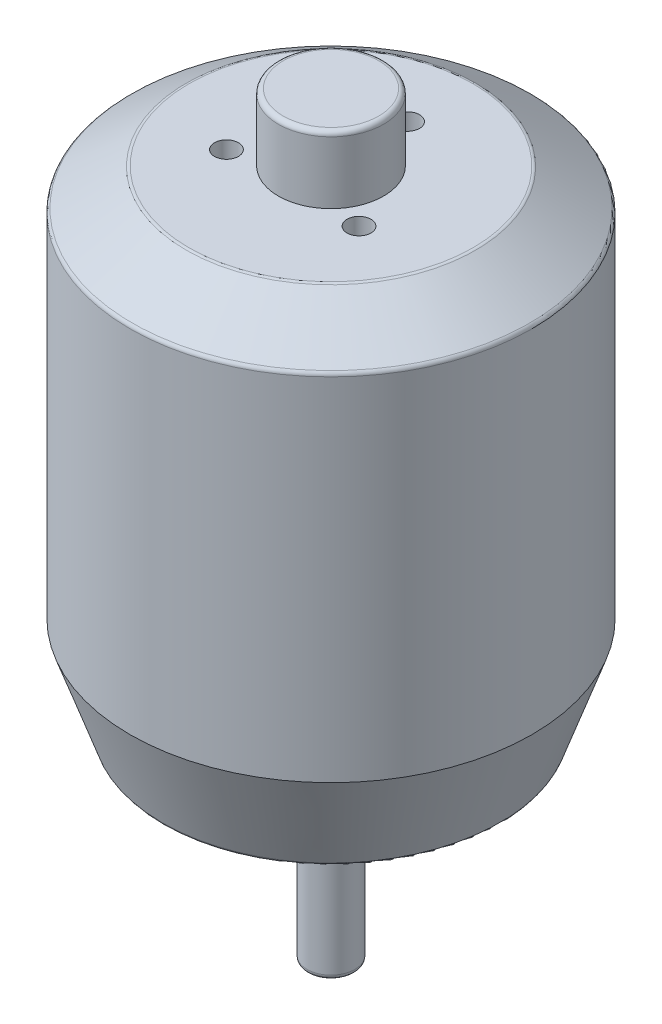
ISO-10303-21;
HEADER;
FILE_DESCRIPTION(('STEP AP214'),'2;1');
FILE_NAME('part.step','',(''),(''),'','','');
FILE_SCHEMA(('AUTOMOTIVE_DESIGN { 1 0 10303 214 1 1 1 1 }'));
ENDSEC;
DATA;
#1=APPLICATION_CONTEXT('core data for automotive mechanical design processes');
#2=APPLICATION_PROTOCOL_DEFINITION('international standard','automotive_design',2000,#1);
#3=PRODUCT_CONTEXT('',#1,'mechanical');
#4=PRODUCT('Part','Part','',(#3));
#5=PRODUCT_RELATED_PRODUCT_CATEGORY('part','',(#4));
#6=PRODUCT_DEFINITION_FORMATION('','',#4);
#7=PRODUCT_DEFINITION_CONTEXT('part definition',#1,'design');
#8=PRODUCT_DEFINITION('design','',#6,#7);
#9=PRODUCT_DEFINITION_SHAPE('','',#8);
#10=(LENGTH_UNIT() NAMED_UNIT(*) SI_UNIT(.MILLI.,.METRE.));
#11=(NAMED_UNIT(*) PLANE_ANGLE_UNIT() SI_UNIT($,.RADIAN.));
#12=(NAMED_UNIT(*) SI_UNIT($,.STERADIAN.) SOLID_ANGLE_UNIT());
#13=UNCERTAINTY_MEASURE_WITH_UNIT(LENGTH_MEASURE(1.E-05),#10,'distance_accuracy_value','');
#14=(GEOMETRIC_REPRESENTATION_CONTEXT(3) GLOBAL_UNCERTAINTY_ASSIGNED_CONTEXT((#13)) GLOBAL_UNIT_ASSIGNED_CONTEXT((#10,
#11,#12)) REPRESENTATION_CONTEXT('',''));
#15=CARTESIAN_POINT('',(0.,0.,0.));
#16=DIRECTION('',(0.,0.,1.));
#17=DIRECTION('',(1.,0.,0.));
#18=AXIS2_PLACEMENT_3D('',#15,#16,#17);
#19=CARTESIAN_POINT('',(0.,47.,0.));
#20=DIRECTION('',(0.,-1.,0.));
#21=DIRECTION('',(0.,0.,-1.));
#22=AXIS2_PLACEMENT_3D('',#19,#20,#21);
#23=CYLINDRICAL_SURFACE('',#22,21.);
#24=CARTESIAN_POINT('',(0.,46.732408120756,0.));
#25=DIRECTION('',(0.,-1.,0.));
#26=DIRECTION('',(0.,0.,-1.));
#27=AXIS2_PLACEMENT_3D('',#24,#25,#26);
#28=CIRCLE('',#27,21.);
#29=CARTESIAN_POINT('',(0.,46.732408120756,-21.));
#30=VERTEX_POINT('',#29);
#31=EDGE_CURVE('E52',#30,#30,#28,.T.);
#32=ORIENTED_EDGE('',*,*,#31,.T.);
#33=EDGE_LOOP('',(#32));
#34=FACE_BOUND('',#33,.T.);
#35=CARTESIAN_POINT('',(0.,10.,0.));
#36=DIRECTION('',(0.,1.,0.));
#37=DIRECTION('',(0.,0.,1.));
#38=AXIS2_PLACEMENT_3D('',#35,#36,#37);
#39=CIRCLE('',#38,21.);
#40=CARTESIAN_POINT('',(0.,10.,21.));
#41=VERTEX_POINT('',#40);
#42=EDGE_CURVE('E86',#41,#41,#39,.T.);
#43=ORIENTED_EDGE('',*,*,#42,.T.);
#44=EDGE_LOOP('',(#43));
#45=FACE_BOUND('',#44,.T.);
#46=ADVANCED_FACE('F37',(#34,#45),#23,.T.);
#47=CARTESIAN_POINT('',(0.,0.,0.));
#48=DIRECTION('',(0.,1.,0.));
#49=DIRECTION('',(0.,0.,1.));
#50=AXIS2_PLACEMENT_3D('',#47,#48,#49);
#51=CONICAL_SURFACE('',#50,17.5,0.336674819386727);
#52=CARTESIAN_POINT('',(0.,0.334824787635947,0.));
#53=DIRECTION('',(0.,1.,0.));
#54=DIRECTION('',(0.,0.,1.));
#55=AXIS2_PLACEMENT_3D('',#52,#53,#54);
#56=CIRCLE('',#55,17.6171886756726);
#57=CARTESIAN_POINT('',(0.,0.334824787635947,17.6171886756726));
#58=VERTEX_POINT('',#57);
#59=EDGE_CURVE('E66',#58,#58,#56,.T.);
#60=ORIENTED_EDGE('',*,*,#59,.T.);
#61=EDGE_LOOP('',(#60));
#62=FACE_BOUND('',#61,.T.);
#63=ORIENTED_EDGE('',*,*,#42,.F.);
#64=EDGE_LOOP('',(#63));
#65=FACE_BOUND('',#64,.T.);
#66=ADVANCED_FACE('F188',(#62,#65),#51,.T.);
#67=CARTESIAN_POINT('',(0.,0.,0.));
#68=DIRECTION('',(0.,1.,0.));
#69=DIRECTION('',(0.,0.,1.));
#70=AXIS2_PLACEMENT_3D('',#67,#68,#69);
#71=PLANE('',#70);
#72=CARTESIAN_POINT('',(0.,0.,0.));
#73=DIRECTION('',(0.,1.,0.));
#74=DIRECTION('',(0.,0.,1.));
#75=AXIS2_PLACEMENT_3D('',#72,#73,#74);
#76=CIRCLE('',#75,17.1452594974896);
#77=CARTESIAN_POINT('',(0.,0.,17.1452594974896));
#78=VERTEX_POINT('',#77);
#79=EDGE_CURVE('E63',#78,#78,#76,.F.);
#80=ORIENTED_EDGE('',*,*,#79,.T.);
#81=EDGE_LOOP('',(#80));
#82=FACE_BOUND('',#81,.T.);
#83=CARTESIAN_POINT('',(0.,0.,0.));
#84=DIRECTION('',(0.,1.,0.));
#85=DIRECTION('',(0.,0.,1.));
#86=AXIS2_PLACEMENT_3D('',#83,#84,#85);
#87=CIRCLE('',#86,5.5);
#88=CARTESIAN_POINT('',(0.,0.,5.5));
#89=VERTEX_POINT('',#88);
#90=EDGE_CURVE('E75',#89,#89,#87,.F.);
#91=ORIENTED_EDGE('',*,*,#90,.F.);
#92=EDGE_LOOP('',(#91));
#93=FACE_BOUND('',#92,.T.);
#94=CARTESIAN_POINT('',(-8.83883476483135,0.,-8.83883476483185));
#95=DIRECTION('',(0.,-1.,0.));
#96=DIRECTION('',(0.,0.,-1.));
#97=AXIS2_PLACEMENT_3D('',#94,#95,#96);
#98=CIRCLE('',#97,4.00000000000026);
#99=CARTESIAN_POINT('',(-8.83883476483135,0.,-12.8388347648321));
#100=VERTEX_POINT('',#99);
#101=EDGE_CURVE('E79',#100,#100,#98,.T.);
#102=ORIENTED_EDGE('',*,*,#101,.F.);
#103=EDGE_LOOP('',(#102));
#104=FACE_BOUND('',#103,.T.);
#105=CARTESIAN_POINT('',(8.83883476483235,0.,-8.83883476483135));
#106=DIRECTION('',(0.,-1.,0.));
#107=DIRECTION('',(0.,0.,-1.));
#108=AXIS2_PLACEMENT_3D('',#105,#106,#107);
#109=CIRCLE('',#108,4.0000000000007);
#110=CARTESIAN_POINT('',(8.83883476483235,0.,-12.838834764832));
#111=VERTEX_POINT('',#110);
#112=EDGE_CURVE('E119',#111,#111,#109,.T.);
#113=ORIENTED_EDGE('',*,*,#112,.F.);
#114=EDGE_LOOP('',(#113));
#115=FACE_BOUND('',#114,.T.);
#116=CARTESIAN_POINT('',(8.83883476483185,0.,8.83883476483234));
#117=DIRECTION('',(0.,-1.,0.));
#118=DIRECTION('',(0.,0.,-1.));
#119=AXIS2_PLACEMENT_3D('',#116,#117,#118);
#120=CIRCLE('',#119,4.00000000000051);
#121=CARTESIAN_POINT('',(8.83883476483185,0.,4.83883476483183));
#122=VERTEX_POINT('',#121);
#123=EDGE_CURVE('E125',#122,#122,#120,.T.);
#124=ORIENTED_EDGE('',*,*,#123,.F.);
#125=EDGE_LOOP('',(#124));
#126=FACE_BOUND('',#125,.T.);
#127=CARTESIAN_POINT('',(-8.83883476483184,0.,8.83883476483184));
#128=DIRECTION('',(0.,-1.,0.));
#129=DIRECTION('',(0.,0.,-1.));
#130=AXIS2_PLACEMENT_3D('',#127,#128,#129);
#131=CIRCLE('',#130,4.);
#132=CARTESIAN_POINT('',(-8.83883476483184,0.,4.83883476483184));
#133=VERTEX_POINT('',#132);
#134=EDGE_CURVE('E131',#133,#133,#131,.T.);
#135=ORIENTED_EDGE('',*,*,#134,.F.);
#136=EDGE_LOOP('',(#135));
#137=FACE_BOUND('',#136,.T.);
#138=CARTESIAN_POINT('',(-12.4999999999996,0.,-3.5527136788005E-13));
#139=DIRECTION('',(0.,-1.,0.));
#140=DIRECTION('',(0.,0.,-1.));
#141=AXIS2_PLACEMENT_3D('',#138,#139,#140);
#142=CIRCLE('',#141,1.50000000000057);
#143=CARTESIAN_POINT('',(-12.4999999999996,0.,-1.50000000000092));
#144=VERTEX_POINT('',#143);
#145=EDGE_CURVE('E96',#144,#144,#142,.T.);
#146=ORIENTED_EDGE('',*,*,#145,.F.);
#147=EDGE_LOOP('',(#146));
#148=FACE_BOUND('',#147,.T.);
#149=CARTESIAN_POINT('',(7.07481118762232E-13,0.,-12.5));
#150=DIRECTION('',(0.,-1.,0.));
#151=DIRECTION('',(0.,0.,-1.));
#152=AXIS2_PLACEMENT_3D('',#149,#150,#151);
#153=CIRCLE('',#152,1.50000000000076);
#154=CARTESIAN_POINT('',(7.07481118762232E-13,0.,-14.0000000000008));
#155=VERTEX_POINT('',#154);
#156=EDGE_CURVE('E103',#155,#155,#153,.T.);
#157=ORIENTED_EDGE('',*,*,#156,.F.);
#158=EDGE_LOOP('',(#157));
#159=FACE_BOUND('',#158,.T.);
#160=CARTESIAN_POINT('',(12.5000000000004,0.,3.53740559381116E-13));
#161=DIRECTION('',(0.,-1.,0.));
#162=DIRECTION('',(0.,0.,-1.));
#163=AXIS2_PLACEMENT_3D('',#160,#161,#162);
#164=CIRCLE('',#163,1.50000000000028);
#165=CARTESIAN_POINT('',(12.5000000000004,0.,-1.49999999999992));
#166=VERTEX_POINT('',#165);
#167=EDGE_CURVE('E109',#166,#166,#164,.T.);
#168=ORIENTED_EDGE('',*,*,#167,.F.);
#169=EDGE_LOOP('',(#168));
#170=FACE_BOUND('',#169,.T.);
#171=CARTESIAN_POINT('',(0.,0.,12.5));
#172=DIRECTION('',(0.,-1.,0.));
#173=DIRECTION('',(0.,0.,-1.));
#174=AXIS2_PLACEMENT_3D('',#171,#172,#173);
#175=CIRCLE('',#174,1.5);
#176=CARTESIAN_POINT('',(0.,0.,11.));
#177=VERTEX_POINT('',#176);
#178=EDGE_CURVE('E90',#177,#177,#175,.T.);
#179=ORIENTED_EDGE('',*,*,#178,.F.);
#180=EDGE_LOOP('',(#179));
#181=FACE_BOUND('',#180,.T.);
#182=ADVANCED_FACE('F194',(#82,#93,#104,#115,#126,#137,#148,#159,#170,#181),#71,.F.);
#183=CARTESIAN_POINT('',(0.,51.,0.));
#184=DIRECTION('',(0.,-1.,0.));
#185=DIRECTION('',(0.,0.,-1.));
#186=AXIS2_PLACEMENT_3D('',#183,#184,#185);
#187=CONICAL_SURFACE('',#186,15.,0.982793723247329);
#188=CARTESIAN_POINT('',(0.,47.1484332679249,0.));
#189=DIRECTION('',(0.,-1.,0.));
#190=DIRECTION('',(0.,0.,-1.));
#191=AXIS2_PLACEMENT_3D('',#188,#189,#190);
#192=CIRCLE('',#191,20.7773500981126);
#193=CARTESIAN_POINT('',(0.,47.1484332679249,-20.7773500981126));
#194=VERTEX_POINT('',#193);
#195=EDGE_CURVE('E57',#194,#194,#192,.F.);
#196=ORIENTED_EDGE('',*,*,#195,.T.);
#197=EDGE_LOOP('',(#196));
#198=FACE_BOUND('',#197,.T.);
#199=CARTESIAN_POINT('',(0.,50.9160251471689,0.));
#200=DIRECTION('',(0.,1.,0.));
#201=DIRECTION('',(0.,0.,1.));
#202=AXIS2_PLACEMENT_3D('',#199,#200,#201);
#203=CIRCLE('',#202,15.1259622792466);
#204=CARTESIAN_POINT('',(0.,50.9160251471689,15.1259622792466));
#205=VERTEX_POINT('',#204);
#206=EDGE_CURVE('E60',#205,#205,#203,.F.);
#207=ORIENTED_EDGE('',*,*,#206,.T.);
#208=EDGE_LOOP('',(#207));
#209=FACE_BOUND('',#208,.T.);
#210=ADVANCED_FACE('F185',(#198,#209),#187,.T.);
#211=CARTESIAN_POINT('',(0.,58.,0.));
#212=DIRECTION('',(0.,1.,0.));
#213=DIRECTION('',(0.,0.,1.));
#214=AXIS2_PLACEMENT_3D('',#211,#212,#213);
#215=PLANE('',#214);
#216=CARTESIAN_POINT('',(0.,58.,0.));
#217=DIRECTION('',(0.,1.,0.));
#218=DIRECTION('',(0.,0.,1.));
#219=AXIS2_PLACEMENT_3D('',#216,#217,#218);
#220=CIRCLE('',#219,5.);
#221=CARTESIAN_POINT('',(0.,58.,5.));
#222=VERTEX_POINT('',#221);
#223=EDGE_CURVE('E44',#222,#222,#220,.T.);
#224=ORIENTED_EDGE('',*,*,#223,.T.);
#225=EDGE_LOOP('',(#224));
#226=FACE_BOUND('',#225,.T.);
#227=ADVANCED_FACE('F180',(#226),#215,.T.);
#228=CARTESIAN_POINT('',(0.,58.,0.));
#229=DIRECTION('',(0.,-1.,0.));
#230=DIRECTION('',(0.,0.,-1.));
#231=AXIS2_PLACEMENT_3D('',#228,#229,#230);
#232=CYLINDRICAL_SURFACE('',#231,5.5);
#233=CARTESIAN_POINT('',(0.,57.5,0.));
#234=DIRECTION('',(0.,1.,0.));
#235=DIRECTION('',(0.,0.,1.));
#236=AXIS2_PLACEMENT_3D('',#233,#234,#235);
#237=CIRCLE('',#236,5.5);
#238=CARTESIAN_POINT('',(0.,57.5,5.5));
#239=VERTEX_POINT('',#238);
#240=EDGE_CURVE('E11',#239,#239,#237,.F.);
#241=ORIENTED_EDGE('',*,*,#240,.T.);
#242=EDGE_LOOP('',(#241));
#243=FACE_BOUND('',#242,.T.);
#244=CARTESIAN_POINT('',(0.,51.,0.));
#245=DIRECTION('',(0.,1.,0.));
#246=DIRECTION('',(0.,0.,1.));
#247=AXIS2_PLACEMENT_3D('',#244,#245,#246);
#248=CIRCLE('',#247,5.5);
#249=CARTESIAN_POINT('',(0.,51.,5.5));
#250=VERTEX_POINT('',#249);
#251=EDGE_CURVE('E83',#250,#250,#248,.T.);
#252=ORIENTED_EDGE('',*,*,#251,.T.);
#253=EDGE_LOOP('',(#252));
#254=FACE_BOUND('',#253,.T.);
#255=ADVANCED_FACE('F170',(#243,#254),#232,.T.);
#256=CARTESIAN_POINT('',(0.,51.,0.));
#257=DIRECTION('',(0.,1.,0.));
#258=DIRECTION('',(0.,0.,1.));
#259=AXIS2_PLACEMENT_3D('',#256,#257,#258);
#260=PLANE('',#259);
#261=CARTESIAN_POINT('',(0.,51.,0.));
#262=DIRECTION('',(0.,1.,0.));
#263=DIRECTION('',(0.,0.,1.));
#264=AXIS2_PLACEMENT_3D('',#261,#262,#263);
#265=CIRCLE('',#264,14.848612181134);
#266=CARTESIAN_POINT('',(0.,51.,14.848612181134));
#267=VERTEX_POINT('',#266);
#268=EDGE_CURVE('E48',#267,#267,#265,.T.);
#269=ORIENTED_EDGE('',*,*,#268,.T.);
#270=EDGE_LOOP('',(#269));
#271=FACE_BOUND('',#270,.T.);
#272=CARTESIAN_POINT('',(6.92820323027602,51.,3.9999999999997));
#273=DIRECTION('',(0.,1.,0.));
#274=DIRECTION('',(0.,0.,1.));
#275=AXIS2_PLACEMENT_3D('',#272,#273,#274);
#276=CIRCLE('',#275,1.25000000000044);
#277=CARTESIAN_POINT('',(6.92820323027602,51.,5.25000000000014));
#278=VERTEX_POINT('',#277);
#279=EDGE_CURVE('E151',#278,#278,#276,.T.);
#280=ORIENTED_EDGE('',*,*,#279,.F.);
#281=EDGE_LOOP('',(#280));
#282=FACE_BOUND('',#281,.T.);
#283=CARTESIAN_POINT('',(-6.928203230275,51.,4.0000000000003));
#284=DIRECTION('',(0.,1.,0.));
#285=DIRECTION('',(0.,0.,1.));
#286=AXIS2_PLACEMENT_3D('',#283,#284,#285);
#287=CIRCLE('',#286,1.25000000000065);
#288=CARTESIAN_POINT('',(-6.928203230275,51.,5.25000000000095));
#289=VERTEX_POINT('',#288);
#290=EDGE_CURVE('E145',#289,#289,#287,.T.);
#291=ORIENTED_EDGE('',*,*,#290,.F.);
#292=EDGE_LOOP('',(#291));
#293=FACE_BOUND('',#292,.T.);
#294=CARTESIAN_POINT('',(0.,51.,-8.));
#295=DIRECTION('',(0.,1.,0.));
#296=DIRECTION('',(0.,0.,1.));
#297=AXIS2_PLACEMENT_3D('',#294,#295,#296);
#298=CIRCLE('',#297,1.25);
#299=CARTESIAN_POINT('',(0.,51.,-6.75));
#300=VERTEX_POINT('',#299);
#301=EDGE_CURVE('E139',#300,#300,#298,.T.);
#302=ORIENTED_EDGE('',*,*,#301,.F.);
#303=EDGE_LOOP('',(#302));
#304=FACE_BOUND('',#303,.T.);
#305=ORIENTED_EDGE('',*,*,#251,.F.);
#306=EDGE_LOOP('',(#305));
#307=FACE_BOUND('',#306,.T.);
#308=ADVANCED_FACE('F166',(#271,#282,#293,#304,#307),#260,.T.);
#309=CARTESIAN_POINT('',(0.,10.,12.5));
#310=DIRECTION('',(0.,-1.,0.));
#311=DIRECTION('',(0.,0.,-1.));
#312=AXIS2_PLACEMENT_3D('',#309,#310,#311);
#313=CYLINDRICAL_SURFACE('',#312,1.5);
#314=CARTESIAN_POINT('',(0.,10.,12.5));
#315=DIRECTION('',(0.,-1.,0.));
#316=DIRECTION('',(0.,0.,-1.));
#317=AXIS2_PLACEMENT_3D('',#314,#315,#316);
#318=CIRCLE('',#317,1.5);
#319=CARTESIAN_POINT('',(0.,10.,11.));
#320=VERTEX_POINT('',#319);
#321=EDGE_CURVE('E89',#320,#320,#318,.T.);
#322=ORIENTED_EDGE('',*,*,#321,.F.);
#323=EDGE_LOOP('',(#322));
#324=FACE_BOUND('',#323,.T.);
#325=ORIENTED_EDGE('',*,*,#178,.T.);
#326=EDGE_LOOP('',(#325));
#327=FACE_BOUND('',#326,.T.);
#328=ADVANCED_FACE('F169',(#324,#327),#313,.F.);
#329=CARTESIAN_POINT('',(0.,10.,12.5));
#330=DIRECTION('',(0.,-1.,0.));
#331=DIRECTION('',(0.,0.,-1.));
#332=AXIS2_PLACEMENT_3D('',#329,#330,#331);
#333=PLANE('',#332);
#334=ORIENTED_EDGE('',*,*,#321,.T.);
#335=EDGE_LOOP('',(#334));
#336=FACE_BOUND('',#335,.T.);
#337=ADVANCED_FACE('F281',(#336),#333,.T.);
#338=CARTESIAN_POINT('',(12.5000000000004,10.,3.53740559381116E-13));
#339=DIRECTION('',(0.,-1.,0.));
#340=DIRECTION('',(0.,0.,-1.));
#341=AXIS2_PLACEMENT_3D('',#338,#339,#340);
#342=CYLINDRICAL_SURFACE('',#341,1.50000000000028);
#343=CARTESIAN_POINT('',(12.5000000000004,10.,3.53740559381116E-13));
#344=DIRECTION('',(0.,-1.,0.));
#345=DIRECTION('',(0.,0.,-1.));
#346=AXIS2_PLACEMENT_3D('',#343,#344,#345);
#347=CIRCLE('',#346,1.50000000000028);
#348=CARTESIAN_POINT('',(12.5000000000004,10.,-1.49999999999992));
#349=VERTEX_POINT('',#348);
#350=EDGE_CURVE('E93',#349,#349,#347,.T.);
#351=ORIENTED_EDGE('',*,*,#350,.F.);
#352=EDGE_LOOP('',(#351));
#353=FACE_BOUND('',#352,.T.);
#354=ORIENTED_EDGE('',*,*,#167,.T.);
#355=EDGE_LOOP('',(#354));
#356=FACE_BOUND('',#355,.T.);
#357=ADVANCED_FACE('F286',(#353,#356),#342,.F.);
#358=CARTESIAN_POINT('',(12.5000000000004,10.,3.53740559381116E-13));
#359=DIRECTION('',(0.,-1.,0.));
#360=DIRECTION('',(0.,0.,-1.));
#361=AXIS2_PLACEMENT_3D('',#358,#359,#360);
#362=PLANE('',#361);
#363=ORIENTED_EDGE('',*,*,#350,.T.);
#364=EDGE_LOOP('',(#363));
#365=FACE_BOUND('',#364,.T.);
#366=ADVANCED_FACE('F292',(#365),#362,.T.);
#367=CARTESIAN_POINT('',(7.07481118762232E-13,10.,-12.5));
#368=DIRECTION('',(0.,-1.,0.));
#369=DIRECTION('',(0.,0.,-1.));
#370=AXIS2_PLACEMENT_3D('',#367,#368,#369);
#371=CYLINDRICAL_SURFACE('',#370,1.50000000000076);
#372=CARTESIAN_POINT('',(7.07481118762232E-13,10.,-12.5));
#373=DIRECTION('',(0.,-1.,0.));
#374=DIRECTION('',(0.,0.,-1.));
#375=AXIS2_PLACEMENT_3D('',#372,#373,#374);
#376=CIRCLE('',#375,1.50000000000076);
#377=CARTESIAN_POINT('',(7.07481118762232E-13,10.,-14.0000000000008));
#378=VERTEX_POINT('',#377);
#379=EDGE_CURVE('E106',#378,#378,#376,.T.);
#380=ORIENTED_EDGE('',*,*,#379,.F.);
#381=EDGE_LOOP('',(#380));
#382=FACE_BOUND('',#381,.T.);
#383=ORIENTED_EDGE('',*,*,#156,.T.);
#384=EDGE_LOOP('',(#383));
#385=FACE_BOUND('',#384,.T.);
#386=ADVANCED_FACE('F306',(#382,#385),#371,.F.);
#387=CARTESIAN_POINT('',(7.07481118762232E-13,10.,-12.5));
#388=DIRECTION('',(0.,-1.,0.));
#389=DIRECTION('',(0.,0.,-1.));
#390=AXIS2_PLACEMENT_3D('',#387,#388,#389);
#391=PLANE('',#390);
#392=ORIENTED_EDGE('',*,*,#379,.T.);
#393=EDGE_LOOP('',(#392));
#394=FACE_BOUND('',#393,.T.);
#395=ADVANCED_FACE('F300',(#394),#391,.T.);
#396=CARTESIAN_POINT('',(-12.4999999999996,10.,-3.5527136788005E-13));
#397=DIRECTION('',(0.,-1.,0.));
#398=DIRECTION('',(0.,0.,-1.));
#399=AXIS2_PLACEMENT_3D('',#396,#397,#398);
#400=CYLINDRICAL_SURFACE('',#399,1.50000000000057);
#401=CARTESIAN_POINT('',(-12.4999999999996,10.,-3.5527136788005E-13));
#402=DIRECTION('',(0.,-1.,0.));
#403=DIRECTION('',(0.,0.,-1.));
#404=AXIS2_PLACEMENT_3D('',#401,#402,#403);
#405=CIRCLE('',#404,1.50000000000057);
#406=CARTESIAN_POINT('',(-12.4999999999996,10.,-1.50000000000092));
#407=VERTEX_POINT('',#406);
#408=EDGE_CURVE('E99',#407,#407,#405,.T.);
#409=ORIENTED_EDGE('',*,*,#408,.F.);
#410=EDGE_LOOP('',(#409));
#411=FACE_BOUND('',#410,.T.);
#412=ORIENTED_EDGE('',*,*,#145,.T.);
#413=EDGE_LOOP('',(#412));
#414=FACE_BOUND('',#413,.T.);
#415=ADVANCED_FACE('F296',(#411,#414),#400,.F.);
#416=CARTESIAN_POINT('',(-12.4999999999996,10.,-3.5527136788005E-13));
#417=DIRECTION('',(0.,-1.,0.));
#418=DIRECTION('',(0.,0.,-1.));
#419=AXIS2_PLACEMENT_3D('',#416,#417,#418);
#420=PLANE('',#419);
#421=ORIENTED_EDGE('',*,*,#408,.T.);
#422=EDGE_LOOP('',(#421));
#423=FACE_BOUND('',#422,.T.);
#424=ADVANCED_FACE('F299',(#423),#420,.T.);
#425=CARTESIAN_POINT('',(-8.83883476483184,10.,8.83883476483184));
#426=DIRECTION('',(0.,-1.,0.));
#427=DIRECTION('',(0.,0.,-1.));
#428=AXIS2_PLACEMENT_3D('',#425,#426,#427);
#429=CYLINDRICAL_SURFACE('',#428,4.);
#430=CARTESIAN_POINT('',(-8.83883476483184,10.,8.83883476483184));
#431=DIRECTION('',(0.,-1.,0.));
#432=DIRECTION('',(0.,0.,-1.));
#433=AXIS2_PLACEMENT_3D('',#430,#431,#432);
#434=CIRCLE('',#433,4.);
#435=CARTESIAN_POINT('',(-8.83883476483184,10.,4.83883476483184));
#436=VERTEX_POINT('',#435);
#437=EDGE_CURVE('E100',#436,#436,#434,.T.);
#438=ORIENTED_EDGE('',*,*,#437,.F.);
#439=EDGE_LOOP('',(#438));
#440=FACE_BOUND('',#439,.T.);
#441=ORIENTED_EDGE('',*,*,#134,.T.);
#442=EDGE_LOOP('',(#441));
#443=FACE_BOUND('',#442,.T.);
#444=ADVANCED_FACE('F304',(#440,#443),#429,.F.);
#445=CARTESIAN_POINT('',(-8.83883476483184,10.,8.83883476483184));
#446=DIRECTION('',(0.,-1.,0.));
#447=DIRECTION('',(0.,0.,-1.));
#448=AXIS2_PLACEMENT_3D('',#445,#446,#447);
#449=PLANE('',#448);
#450=ORIENTED_EDGE('',*,*,#437,.T.);
#451=EDGE_LOOP('',(#450));
#452=FACE_BOUND('',#451,.T.);
#453=ADVANCED_FACE('F335',(#452),#449,.T.);
#454=CARTESIAN_POINT('',(8.83883476483185,10.,8.83883476483234));
#455=DIRECTION('',(0.,-1.,0.));
#456=DIRECTION('',(0.,0.,-1.));
#457=AXIS2_PLACEMENT_3D('',#454,#455,#456);
#458=CYLINDRICAL_SURFACE('',#457,4.00000000000051);
#459=CARTESIAN_POINT('',(8.83883476483185,10.,8.83883476483234));
#460=DIRECTION('',(0.,-1.,0.));
#461=DIRECTION('',(0.,0.,-1.));
#462=AXIS2_PLACEMENT_3D('',#459,#460,#461);
#463=CIRCLE('',#462,4.00000000000051);
#464=CARTESIAN_POINT('',(8.83883476483185,10.,4.83883476483183));
#465=VERTEX_POINT('',#464);
#466=EDGE_CURVE('E128',#465,#465,#463,.T.);
#467=ORIENTED_EDGE('',*,*,#466,.F.);
#468=EDGE_LOOP('',(#467));
#469=FACE_BOUND('',#468,.T.);
#470=ORIENTED_EDGE('',*,*,#123,.T.);
#471=EDGE_LOOP('',(#470));
#472=FACE_BOUND('',#471,.T.);
#473=ADVANCED_FACE('F332',(#469,#472),#458,.F.);
#474=CARTESIAN_POINT('',(8.83883476483185,10.,8.83883476483234));
#475=DIRECTION('',(0.,-1.,0.));
#476=DIRECTION('',(0.,0.,-1.));
#477=AXIS2_PLACEMENT_3D('',#474,#475,#476);
#478=PLANE('',#477);
#479=ORIENTED_EDGE('',*,*,#466,.T.);
#480=EDGE_LOOP('',(#479));
#481=FACE_BOUND('',#480,.T.);
#482=ADVANCED_FACE('F327',(#481),#478,.T.);
#483=CARTESIAN_POINT('',(8.83883476483235,10.,-8.83883476483135));
#484=DIRECTION('',(0.,-1.,0.));
#485=DIRECTION('',(0.,0.,-1.));
#486=AXIS2_PLACEMENT_3D('',#483,#484,#485);
#487=CYLINDRICAL_SURFACE('',#486,4.0000000000007);
#488=CARTESIAN_POINT('',(8.83883476483235,10.,-8.83883476483135));
#489=DIRECTION('',(0.,-1.,0.));
#490=DIRECTION('',(0.,0.,-1.));
#491=AXIS2_PLACEMENT_3D('',#488,#489,#490);
#492=CIRCLE('',#491,4.0000000000007);
#493=CARTESIAN_POINT('',(8.83883476483235,10.,-12.838834764832));
#494=VERTEX_POINT('',#493);
#495=EDGE_CURVE('E122',#494,#494,#492,.T.);
#496=ORIENTED_EDGE('',*,*,#495,.F.);
#497=EDGE_LOOP('',(#496));
#498=FACE_BOUND('',#497,.T.);
#499=ORIENTED_EDGE('',*,*,#112,.T.);
#500=EDGE_LOOP('',(#499));
#501=FACE_BOUND('',#500,.T.);
#502=ADVANCED_FACE('F324',(#498,#501),#487,.F.);
#503=CARTESIAN_POINT('',(8.83883476483235,10.,-8.83883476483135));
#504=DIRECTION('',(0.,-1.,0.));
#505=DIRECTION('',(0.,0.,-1.));
#506=AXIS2_PLACEMENT_3D('',#503,#504,#505);
#507=PLANE('',#506);
#508=ORIENTED_EDGE('',*,*,#495,.T.);
#509=EDGE_LOOP('',(#508));
#510=FACE_BOUND('',#509,.T.);
#511=ADVANCED_FACE('F319',(#510),#507,.T.);
#512=CARTESIAN_POINT('',(-8.83883476483135,10.,-8.83883476483185));
#513=DIRECTION('',(0.,-1.,0.));
#514=DIRECTION('',(0.,0.,-1.));
#515=AXIS2_PLACEMENT_3D('',#512,#513,#514);
#516=CYLINDRICAL_SURFACE('',#515,4.00000000000026);
#517=CARTESIAN_POINT('',(-8.83883476483135,10.,-8.83883476483185));
#518=DIRECTION('',(0.,-1.,0.));
#519=DIRECTION('',(0.,0.,-1.));
#520=AXIS2_PLACEMENT_3D('',#517,#518,#519);
#521=CIRCLE('',#520,4.00000000000026);
#522=CARTESIAN_POINT('',(-8.83883476483135,10.,-12.8388347648321));
#523=VERTEX_POINT('',#522);
#524=EDGE_CURVE('E116',#523,#523,#521,.T.);
#525=ORIENTED_EDGE('',*,*,#524,.F.);
#526=EDGE_LOOP('',(#525));
#527=FACE_BOUND('',#526,.T.);
#528=ORIENTED_EDGE('',*,*,#101,.T.);
#529=EDGE_LOOP('',(#528));
#530=FACE_BOUND('',#529,.T.);
#531=ADVANCED_FACE('F316',(#527,#530),#516,.F.);
#532=CARTESIAN_POINT('',(-8.83883476483135,10.,-8.83883476483185));
#533=DIRECTION('',(0.,-1.,0.));
#534=DIRECTION('',(0.,0.,-1.));
#535=AXIS2_PLACEMENT_3D('',#532,#533,#534);
#536=PLANE('',#535);
#537=ORIENTED_EDGE('',*,*,#524,.T.);
#538=EDGE_LOOP('',(#537));
#539=FACE_BOUND('',#538,.T.);
#540=ADVANCED_FACE('F259',(#539),#536,.T.);
#541=CARTESIAN_POINT('',(0.,-1.,0.));
#542=DIRECTION('',(0.,1.,0.));
#543=DIRECTION('',(0.,0.,1.));
#544=AXIS2_PLACEMENT_3D('',#541,#542,#543);
#545=CYLINDRICAL_SURFACE('',#544,5.5);
#546=CARTESIAN_POINT('',(0.,-1.,0.));
#547=DIRECTION('',(0.,-1.,0.));
#548=DIRECTION('',(0.,0.,-1.));
#549=AXIS2_PLACEMENT_3D('',#546,#547,#548);
#550=CIRCLE('',#549,5.5);
#551=CARTESIAN_POINT('',(0.,-1.,-5.5));
#552=VERTEX_POINT('',#551);
#553=EDGE_CURVE('E80',#552,#552,#550,.T.);
#554=ORIENTED_EDGE('',*,*,#553,.F.);
#555=EDGE_LOOP('',(#554));
#556=FACE_BOUND('',#555,.T.);
#557=ORIENTED_EDGE('',*,*,#90,.T.);
#558=EDGE_LOOP('',(#557));
#559=FACE_BOUND('',#558,.T.);
#560=ADVANCED_FACE('F253',(#556,#559),#545,.T.);
#561=CARTESIAN_POINT('',(0.,-1.,0.));
#562=DIRECTION('',(0.,-1.,0.));
#563=DIRECTION('',(0.,0.,-1.));
#564=AXIS2_PLACEMENT_3D('',#561,#562,#563);
#565=PLANE('',#564);
#566=CARTESIAN_POINT('',(0.,-1.,0.));
#567=DIRECTION('',(0.,-1.,0.));
#568=DIRECTION('',(0.,0.,-1.));
#569=AXIS2_PLACEMENT_3D('',#566,#567,#568);
#570=CIRCLE('',#569,2.5);
#571=CARTESIAN_POINT('',(0.,-1.,2.5));
#572=VERTEX_POINT('',#571);
#573=EDGE_CURVE('E76',#572,#572,#570,.T.);
#574=ORIENTED_EDGE('',*,*,#573,.F.);
#575=EDGE_LOOP('',(#574));
#576=FACE_BOUND('',#575,.T.);
#577=ORIENTED_EDGE('',*,*,#553,.T.);
#578=EDGE_LOOP('',(#577));
#579=FACE_BOUND('',#578,.T.);
#580=ADVANCED_FACE('F236',(#576,#579),#565,.T.);
#581=CARTESIAN_POINT('',(0.,-21.,0.));
#582=DIRECTION('',(0.,-1.,0.));
#583=DIRECTION('',(0.,0.,-1.));
#584=AXIS2_PLACEMENT_3D('',#581,#582,#583);
#585=PLANE('',#584);
#586=CARTESIAN_POINT('',(0.,-21.,0.));
#587=DIRECTION('',(0.,-1.,0.));
#588=DIRECTION('',(0.,0.,-1.));
#589=AXIS2_PLACEMENT_3D('',#586,#587,#588);
#590=CIRCLE('',#589,2.);
#591=CARTESIAN_POINT('',(0.,-21.,-2.));
#592=VERTEX_POINT('',#591);
#593=EDGE_CURVE('E72',#592,#592,#590,.T.);
#594=ORIENTED_EDGE('',*,*,#593,.T.);
#595=EDGE_LOOP('',(#594));
#596=FACE_BOUND('',#595,.T.);
#597=ADVANCED_FACE('F232',(#596),#585,.T.);
#598=CARTESIAN_POINT('',(0.,-21.,0.));
#599=DIRECTION('',(0.,1.,0.));
#600=DIRECTION('',(0.,0.,1.));
#601=AXIS2_PLACEMENT_3D('',#598,#599,#600);
#602=CYLINDRICAL_SURFACE('',#601,2.5);
#603=CARTESIAN_POINT('',(0.,-20.5,0.));
#604=DIRECTION('',(0.,-1.,0.));
#605=DIRECTION('',(0.,0.,-1.));
#606=AXIS2_PLACEMENT_3D('',#603,#604,#605);
#607=CIRCLE('',#606,2.5);
#608=CARTESIAN_POINT('',(0.,-20.5,2.5));
#609=VERTEX_POINT('',#608);
#610=EDGE_CURVE('E69',#609,#609,#607,.F.);
#611=CARTESIAN_POINT('',(0.,-20.5,2.5));
#612=CARTESIAN_POINT('',(0.,-20.296875,2.5));
#613=CARTESIAN_POINT('',(0.,-20.09375,2.5));
#614=CARTESIAN_POINT('',(0.,-19.6875,2.5));
#615=CARTESIAN_POINT('',(0.,-19.484375,2.5));
#616=CARTESIAN_POINT('',(0.,-19.078125,2.5));
#617=CARTESIAN_POINT('',(0.,-18.875,2.5));
#618=CARTESIAN_POINT('',(0.,-18.46875,2.5));
#619=CARTESIAN_POINT('',(0.,-18.265625,2.5));
#620=CARTESIAN_POINT('',(0.,-17.859375,2.5));
#621=CARTESIAN_POINT('',(0.,-17.65625,2.5));
#622=CARTESIAN_POINT('',(0.,-17.25,2.5));
#623=CARTESIAN_POINT('',(0.,-17.046875,2.5));
#624=CARTESIAN_POINT('',(0.,-16.640625,2.5));
#625=CARTESIAN_POINT('',(0.,-16.4375,2.5));
#626=CARTESIAN_POINT('',(0.,-16.03125,2.5));
#627=CARTESIAN_POINT('',(0.,-15.828125,2.5));
#628=CARTESIAN_POINT('',(0.,-15.421875,2.5));
#629=CARTESIAN_POINT('',(0.,-15.21875,2.5));
#630=CARTESIAN_POINT('',(0.,-14.8125,2.5));
#631=CARTESIAN_POINT('',(0.,-14.609375,2.5));
#632=CARTESIAN_POINT('',(0.,-14.203125,2.5));
#633=CARTESIAN_POINT('',(0.,-14.,2.5));
#634=CARTESIAN_POINT('',(0.,-13.59375,2.5));
#635=CARTESIAN_POINT('',(0.,-13.390625,2.5));
#636=CARTESIAN_POINT('',(0.,-12.984375,2.5));
#637=CARTESIAN_POINT('',(0.,-12.78125,2.5));
#638=CARTESIAN_POINT('',(0.,-12.375,2.5));
#639=CARTESIAN_POINT('',(0.,-12.171875,2.5));
#640=CARTESIAN_POINT('',(0.,-11.765625,2.5));
#641=CARTESIAN_POINT('',(0.,-11.5625,2.5));
#642=CARTESIAN_POINT('',(0.,-11.15625,2.5));
#643=CARTESIAN_POINT('',(0.,-10.953125,2.5));
#644=CARTESIAN_POINT('',(0.,-10.546875,2.5));
#645=CARTESIAN_POINT('',(0.,-10.34375,2.5));
#646=CARTESIAN_POINT('',(0.,-9.9375,2.5));
#647=CARTESIAN_POINT('',(0.,-9.734375,2.5));
#648=CARTESIAN_POINT('',(0.,-9.328125,2.5));
#649=CARTESIAN_POINT('',(0.,-9.125,2.5));
#650=CARTESIAN_POINT('',(0.,-8.71875,2.5));
#651=CARTESIAN_POINT('',(0.,-8.515625,2.5));
#652=CARTESIAN_POINT('',(0.,-8.109375,2.5));
#653=CARTESIAN_POINT('',(0.,-7.90625,2.5));
#654=CARTESIAN_POINT('',(0.,-7.5,2.5));
#655=CARTESIAN_POINT('',(0.,-7.296875,2.5));
#656=CARTESIAN_POINT('',(0.,-6.890625,2.5));
#657=CARTESIAN_POINT('',(0.,-6.6875,2.5));
#658=CARTESIAN_POINT('',(0.,-6.28125,2.5));
#659=CARTESIAN_POINT('',(0.,-6.078125,2.5));
#660=CARTESIAN_POINT('',(0.,-5.671875,2.5));
#661=CARTESIAN_POINT('',(0.,-5.46875,2.5));
#662=CARTESIAN_POINT('',(0.,-5.0625,2.5));
#663=CARTESIAN_POINT('',(0.,-4.859375,2.5));
#664=CARTESIAN_POINT('',(0.,-4.453125,2.5));
#665=CARTESIAN_POINT('',(0.,-4.25,2.5));
#666=CARTESIAN_POINT('',(0.,-3.84375,2.5));
#667=CARTESIAN_POINT('',(0.,-3.640625,2.5));
#668=CARTESIAN_POINT('',(0.,-3.234375,2.5));
#669=CARTESIAN_POINT('',(0.,-3.03125,2.5));
#670=CARTESIAN_POINT('',(0.,-2.625,2.5));
#671=CARTESIAN_POINT('',(0.,-2.421875,2.5));
#672=CARTESIAN_POINT('',(0.,-2.015625,2.5));
#673=CARTESIAN_POINT('',(0.,-1.8125,2.5));
#674=CARTESIAN_POINT('',(0.,-1.40625,2.5));
#675=CARTESIAN_POINT('',(0.,-1.203125,2.5));
#676=CARTESIAN_POINT('',(0.,-1.,2.5));
#677=B_SPLINE_CURVE_WITH_KNOTS('',3,(#611,#612,#613,#614,#615,#616,#617,#618,#619,#620,#621,
#622,#623,#624,#625,#626,#627,#628,#629,#630,#631,#632,#633,#634,#635,#636,#637,#638,#639,#640,
#641,#642,#643,#644,#645,#646,#647,#648,#649,#650,#651,#652,#653,#654,#655,#656,#657,#658,#659,
#660,#661,#662,#663,#664,#665,#666,#667,#668,#669,#670,#671,#672,#673,#674,#675,#676),
.UNSPECIFIED.,.F.,.F.,(4,2,2,2,2,2,2,2,2,2,2,2,2,2,2,2,2,2,2,2,2,2,2,2,2,2,2,2,2,2,2,2,4),(0.,
0.609375000000002,1.21875,1.828125,2.4375,3.046875,3.65625,4.265625,4.875,5.484375,6.09375,
6.703125,7.3125,7.921875,8.53125,9.140625,9.75,10.359375,10.96875,11.578125,12.1875,12.796875,
13.40625,14.015625,14.625,15.234375,15.84375,16.453125,17.0625,17.671875,18.28125,18.890625,
19.5),.UNSPECIFIED.);
#678=EDGE_CURVE('BSEAM235',#609,#572,#677,.T.);
#679=ORIENTED_EDGE('',*,*,#610,.T.);
#680=ORIENTED_EDGE('',*,*,#573,.T.);
#681=ORIENTED_EDGE('',*,*,#678,.T.);
#682=ORIENTED_EDGE('',*,*,#678,.F.);
#683=EDGE_LOOP('',(#679,#681,#680,#682));
#684=FACE_BOUND('',#683,.T.);
#685=ADVANCED_FACE('F235',(#684),#602,.T.);
#686=CARTESIAN_POINT('',(0.,41.,-8.));
#687=DIRECTION('',(0.,1.,0.));
#688=DIRECTION('',(0.,0.,1.));
#689=AXIS2_PLACEMENT_3D('',#686,#687,#688);
#690=CYLINDRICAL_SURFACE('',#689,1.25);
#691=CARTESIAN_POINT('',(0.,41.,-8.));
#692=DIRECTION('',(0.,1.,0.));
#693=DIRECTION('',(0.,0.,1.));
#694=AXIS2_PLACEMENT_3D('',#691,#692,#693);
#695=CIRCLE('',#694,1.25);
#696=CARTESIAN_POINT('',(0.,41.,-6.75));
#697=VERTEX_POINT('',#696);
#698=EDGE_CURVE('E138',#697,#697,#695,.T.);
#699=ORIENTED_EDGE('',*,*,#698,.F.);
#700=EDGE_LOOP('',(#699));
#701=FACE_BOUND('',#700,.T.);
#702=ORIENTED_EDGE('',*,*,#301,.T.);
#703=EDGE_LOOP('',(#702));
#704=FACE_BOUND('',#703,.T.);
#705=ADVANCED_FACE('F239',(#701,#704),#690,.F.);
#706=CARTESIAN_POINT('',(0.,41.,-8.));
#707=DIRECTION('',(0.,1.,0.));
#708=DIRECTION('',(0.,0.,1.));
#709=AXIS2_PLACEMENT_3D('',#706,#707,#708);
#710=PLANE('',#709);
#711=ORIENTED_EDGE('',*,*,#698,.T.);
#712=EDGE_LOOP('',(#711));
#713=FACE_BOUND('',#712,.T.);
#714=ADVANCED_FACE('F244',(#713),#710,.T.);
#715=CARTESIAN_POINT('',(-6.928203230275,41.,4.0000000000003));
#716=DIRECTION('',(0.,1.,0.));
#717=DIRECTION('',(0.,0.,1.));
#718=AXIS2_PLACEMENT_3D('',#715,#716,#717);
#719=CYLINDRICAL_SURFACE('',#718,1.25000000000065);
#720=CARTESIAN_POINT('',(-6.928203230275,41.,4.0000000000003));
#721=DIRECTION('',(0.,1.,0.));
#722=DIRECTION('',(0.,0.,1.));
#723=AXIS2_PLACEMENT_3D('',#720,#721,#722);
#724=CIRCLE('',#723,1.25000000000065);
#725=CARTESIAN_POINT('',(-6.928203230275,41.,5.25000000000095));
#726=VERTEX_POINT('',#725);
#727=EDGE_CURVE('E148',#726,#726,#724,.T.);
#728=ORIENTED_EDGE('',*,*,#727,.F.);
#729=EDGE_LOOP('',(#728));
#730=FACE_BOUND('',#729,.T.);
#731=ORIENTED_EDGE('',*,*,#290,.T.);
#732=EDGE_LOOP('',(#731));
#733=FACE_BOUND('',#732,.T.);
#734=ADVANCED_FACE('F348',(#730,#733),#719,.F.);
#735=CARTESIAN_POINT('',(-6.928203230275,41.,4.0000000000003));
#736=DIRECTION('',(0.,1.,0.));
#737=DIRECTION('',(0.,0.,1.));
#738=AXIS2_PLACEMENT_3D('',#735,#736,#737);
#739=PLANE('',#738);
#740=ORIENTED_EDGE('',*,*,#727,.T.);
#741=EDGE_LOOP('',(#740));
#742=FACE_BOUND('',#741,.T.);
#743=ADVANCED_FACE('F162',(#742),#739,.T.);
#744=CARTESIAN_POINT('',(6.92820323027602,41.,3.9999999999997));
#745=DIRECTION('',(0.,1.,0.));
#746=DIRECTION('',(0.,0.,1.));
#747=AXIS2_PLACEMENT_3D('',#744,#745,#746);
#748=CYLINDRICAL_SURFACE('',#747,1.25000000000044);
#749=CARTESIAN_POINT('',(6.92820323027602,41.,3.9999999999997));
#750=DIRECTION('',(0.,1.,0.));
#751=DIRECTION('',(0.,0.,1.));
#752=AXIS2_PLACEMENT_3D('',#749,#750,#751);
#753=CIRCLE('',#752,1.25000000000044);
#754=CARTESIAN_POINT('',(6.92820323027602,41.,5.25000000000014));
#755=VERTEX_POINT('',#754);
#756=EDGE_CURVE('E142',#755,#755,#753,.T.);
#757=ORIENTED_EDGE('',*,*,#756,.F.);
#758=EDGE_LOOP('',(#757));
#759=FACE_BOUND('',#758,.T.);
#760=ORIENTED_EDGE('',*,*,#279,.T.);
#761=EDGE_LOOP('',(#760));
#762=FACE_BOUND('',#761,.T.);
#763=ADVANCED_FACE('F159',(#759,#762),#748,.F.);
#764=CARTESIAN_POINT('',(6.92820323027602,41.,3.9999999999997));
#765=DIRECTION('',(0.,1.,0.));
#766=DIRECTION('',(0.,0.,1.));
#767=AXIS2_PLACEMENT_3D('',#764,#765,#766);
#768=PLANE('',#767);
#769=ORIENTED_EDGE('',*,*,#756,.T.);
#770=EDGE_LOOP('',(#769));
#771=FACE_BOUND('',#770,.T.);
#772=ADVANCED_FACE('F157',(#771),#768,.T.);
#773=CARTESIAN_POINT('',(0.,-20.5,0.));
#774=DIRECTION('',(0.,-1.,0.));
#775=DIRECTION('',(0.,0.,-1.));
#776=AXIS2_PLACEMENT_3D('',#773,#774,#775);
#777=TOROIDAL_SURFACE('',#776,2.,0.5);
#778=ORIENTED_EDGE('',*,*,#610,.F.);
#779=EDGE_LOOP('',(#778));
#780=FACE_BOUND('',#779,.T.);
#781=ORIENTED_EDGE('',*,*,#593,.F.);
#782=EDGE_LOOP('',(#781));
#783=FACE_BOUND('',#782,.T.);
#784=ADVANCED_FACE('F202',(#780,#783),#777,.T.);
#785=CARTESIAN_POINT('',(0.,0.5,0.));
#786=DIRECTION('',(0.,1.,0.));
#787=DIRECTION('',(0.,0.,1.));
#788=AXIS2_PLACEMENT_3D('',#785,#786,#787);
#789=TOROIDAL_SURFACE('',#788,17.1452594974896,0.5);
#790=ORIENTED_EDGE('',*,*,#79,.F.);
#791=EDGE_LOOP('',(#790));
#792=FACE_BOUND('',#791,.T.);
#793=ORIENTED_EDGE('',*,*,#59,.F.);
#794=EDGE_LOOP('',(#793));
#795=FACE_BOUND('',#794,.T.);
#796=ADVANCED_FACE('F205',(#792,#795),#789,.T.);
#797=CARTESIAN_POINT('',(0.,46.732408120756,0.));
#798=DIRECTION('',(0.,-1.,0.));
#799=DIRECTION('',(0.,0.,-1.));
#800=AXIS2_PLACEMENT_3D('',#797,#798,#799);
#801=TOROIDAL_SURFACE('',#800,20.5,0.5);
#802=ORIENTED_EDGE('',*,*,#31,.F.);
#803=EDGE_LOOP('',(#802));
#804=FACE_BOUND('',#803,.T.);
#805=ORIENTED_EDGE('',*,*,#195,.F.);
#806=EDGE_LOOP('',(#805));
#807=FACE_BOUND('',#806,.T.);
#808=ADVANCED_FACE('F209',(#804,#807),#801,.T.);
#809=CARTESIAN_POINT('',(0.,50.5,0.));
#810=DIRECTION('',(0.,1.,0.));
#811=DIRECTION('',(0.,0.,1.));
#812=AXIS2_PLACEMENT_3D('',#809,#810,#811);
#813=TOROIDAL_SURFACE('',#812,14.848612181134,0.5);
#814=ORIENTED_EDGE('',*,*,#206,.F.);
#815=EDGE_LOOP('',(#814));
#816=FACE_BOUND('',#815,.T.);
#817=ORIENTED_EDGE('',*,*,#268,.F.);
#818=EDGE_LOOP('',(#817));
#819=FACE_BOUND('',#818,.T.);
#820=ADVANCED_FACE('F212',(#816,#819),#813,.T.);
#821=CARTESIAN_POINT('',(0.,57.5,0.));
#822=DIRECTION('',(0.,1.,0.));
#823=DIRECTION('',(0.,0.,1.));
#824=AXIS2_PLACEMENT_3D('',#821,#822,#823);
#825=TOROIDAL_SURFACE('',#824,5.,0.5);
#826=ORIENTED_EDGE('',*,*,#240,.F.);
#827=EDGE_LOOP('',(#826));
#828=FACE_BOUND('',#827,.T.);
#829=ORIENTED_EDGE('',*,*,#223,.F.);
#830=EDGE_LOOP('',(#829));
#831=FACE_BOUND('',#830,.T.);
#832=ADVANCED_FACE('F39',(#828,#831),#825,.T.);
#833=CLOSED_SHELL('',(#46,#66,#182,#210,#227,#255,#308,#328,#337,#357,#366,#386,#395,#415,#424,
#444,#453,#473,#482,#502,#511,#531,#540,#560,#580,#597,#685,#705,#714,#734,#743,#763,#772,#784,
#796,#808,#820,#832));
#834=MANIFOLD_SOLID_BREP('B2',#833);
#835=ADVANCED_BREP_SHAPE_REPRESENTATION('',(#18,#834),#14);
#836=SHAPE_DEFINITION_REPRESENTATION(#9,#835);
ENDSEC;
END-ISO-10303-21;
